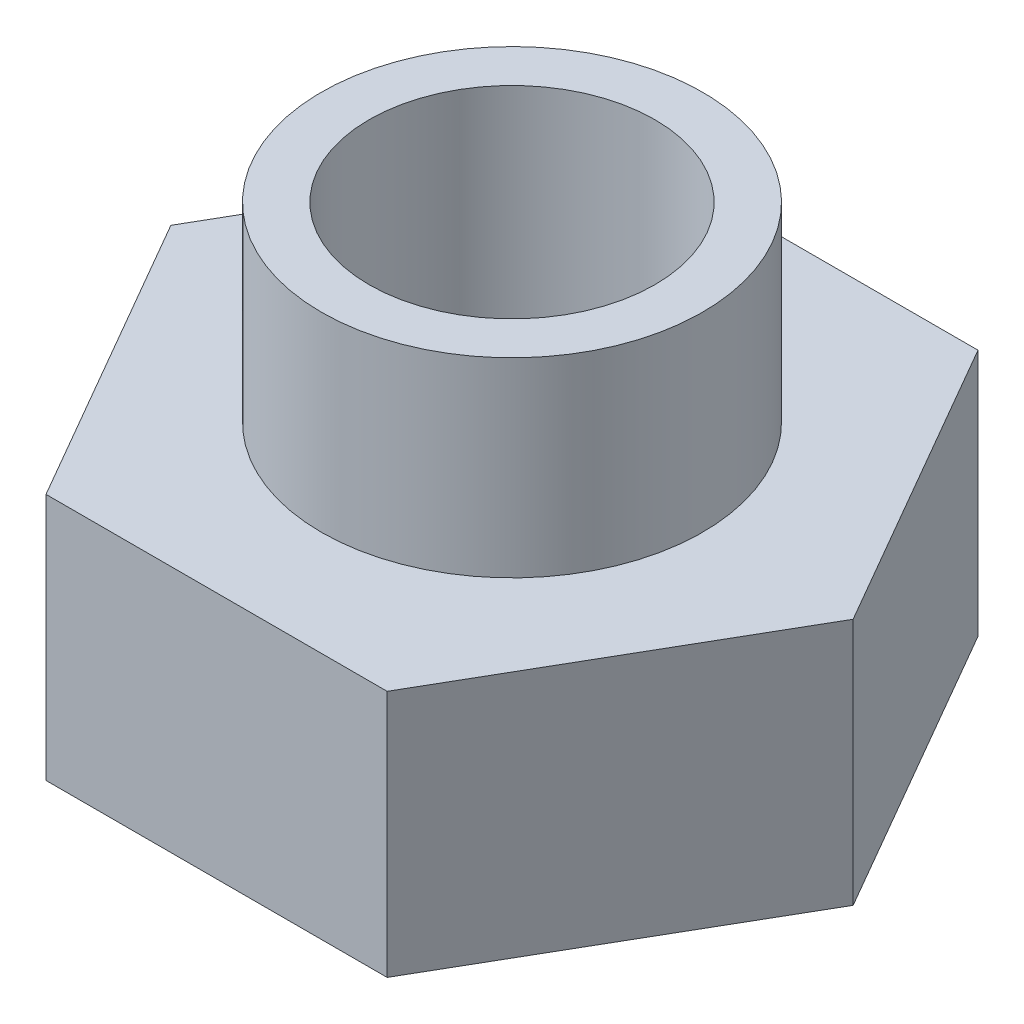
ISO-10303-21;
HEADER;
FILE_DESCRIPTION(('STEP AP214'),'2;1');
FILE_NAME('part.step','',(''),(''),'','','');
FILE_SCHEMA(('AUTOMOTIVE_DESIGN { 1 0 10303 214 1 1 1 1 }'));
ENDSEC;
DATA;
#1=APPLICATION_CONTEXT('core data for automotive mechanical design processes');
#2=APPLICATION_PROTOCOL_DEFINITION('international standard','automotive_design',2000,#1);
#3=PRODUCT_CONTEXT('',#1,'mechanical');
#4=PRODUCT('Part','Part','',(#3));
#5=PRODUCT_RELATED_PRODUCT_CATEGORY('part','',(#4));
#6=PRODUCT_DEFINITION_FORMATION('','',#4);
#7=PRODUCT_DEFINITION_CONTEXT('part definition',#1,'design');
#8=PRODUCT_DEFINITION('design','',#6,#7);
#9=PRODUCT_DEFINITION_SHAPE('','',#8);
#10=(LENGTH_UNIT() NAMED_UNIT(*) SI_UNIT(.MILLI.,.METRE.));
#11=(NAMED_UNIT(*) PLANE_ANGLE_UNIT() SI_UNIT($,.RADIAN.));
#12=(NAMED_UNIT(*) SI_UNIT($,.STERADIAN.) SOLID_ANGLE_UNIT());
#13=UNCERTAINTY_MEASURE_WITH_UNIT(LENGTH_MEASURE(1.E-05),#10,'distance_accuracy_value','');
#14=(GEOMETRIC_REPRESENTATION_CONTEXT(3) GLOBAL_UNCERTAINTY_ASSIGNED_CONTEXT((#13)) GLOBAL_UNIT_ASSIGNED_CONTEXT((#10,
#11,#12)) REPRESENTATION_CONTEXT('',''));
#15=CARTESIAN_POINT('',(0.,0.,0.));
#16=DIRECTION('',(0.,0.,1.));
#17=DIRECTION('',(1.,0.,0.));
#18=AXIS2_PLACEMENT_3D('',#15,#16,#17);
#19=CARTESIAN_POINT('',(-67.116968793294,65.,38.75));
#20=DIRECTION('',(0.866025403784439,0.,-0.5));
#21=DIRECTION('',(-0.5,0.,-0.866025403784439));
#22=AXIS2_PLACEMENT_3D('',#19,#20,#21);
#23=PLANE('',#22);
#24=DIRECTION('',(0.5,0.,0.866025403784439));
#25=VECTOR('',#24,1.);
#26=CARTESIAN_POINT('',(-67.116968793294,0.,38.75));
#27=LINE('',#26,#25);
#28=CARTESIAN_POINT('',(-89.489291724392,0.,0.));
#29=VERTEX_POINT('',#28);
#30=CARTESIAN_POINT('',(-44.744645862196,0.,77.5));
#31=VERTEX_POINT('',#30);
#32=EDGE_CURVE('E121',#29,#31,#27,.T.);
#33=ORIENTED_EDGE('',*,*,#32,.T.);
#34=DIRECTION('',(0.,-1.,0.));
#35=VECTOR('',#34,1.);
#36=CARTESIAN_POINT('',(-44.744645862196,65.,77.5));
#37=LINE('',#36,#35);
#38=CARTESIAN_POINT('',(-44.744645862196,65.,77.5));
#39=VERTEX_POINT('',#38);
#40=EDGE_CURVE('E11',#39,#31,#37,.T.);
#41=ORIENTED_EDGE('',*,*,#40,.F.);
#42=DIRECTION('',(0.5,0.,0.866025403784439));
#43=VECTOR('',#42,1.);
#44=CARTESIAN_POINT('',(-67.116968793294,65.,38.75));
#45=LINE('',#44,#43);
#46=CARTESIAN_POINT('',(-89.489291724392,65.,0.));
#47=VERTEX_POINT('',#46);
#48=EDGE_CURVE('E146',#47,#39,#45,.T.);
#49=ORIENTED_EDGE('',*,*,#48,.F.);
#50=DIRECTION('',(0.,-1.,0.));
#51=VECTOR('',#50,1.);
#52=CARTESIAN_POINT('',(-89.489291724392,65.,0.));
#53=LINE('',#52,#51);
#54=EDGE_CURVE('E117',#47,#29,#53,.T.);
#55=ORIENTED_EDGE('',*,*,#54,.T.);
#56=EDGE_LOOP('',(#33,#41,#49,#55));
#57=FACE_BOUND('',#56,.T.);
#58=ADVANCED_FACE('F37',(#57),#23,.F.);
#59=CARTESIAN_POINT('',(0.,65.,77.5));
#60=DIRECTION('',(0.,0.,-1.));
#61=DIRECTION('',(-1.,0.,0.));
#62=AXIS2_PLACEMENT_3D('',#59,#60,#61);
#63=PLANE('',#62);
#64=DIRECTION('',(1.,0.,0.));
#65=VECTOR('',#64,1.);
#66=CARTESIAN_POINT('',(0.,0.,77.5));
#67=LINE('',#66,#65);
#68=CARTESIAN_POINT('',(44.744645862196,0.,77.5));
#69=VERTEX_POINT('',#68);
#70=EDGE_CURVE('E124',#31,#69,#67,.T.);
#71=ORIENTED_EDGE('',*,*,#70,.T.);
#72=DIRECTION('',(0.,-1.,0.));
#73=VECTOR('',#72,1.);
#74=CARTESIAN_POINT('',(44.744645862196,65.,77.5));
#75=LINE('',#74,#73);
#76=CARTESIAN_POINT('',(44.744645862196,65.,77.5));
#77=VERTEX_POINT('',#76);
#78=EDGE_CURVE('E45',#77,#69,#75,.T.);
#79=ORIENTED_EDGE('',*,*,#78,.F.);
#80=DIRECTION('',(1.,0.,0.));
#81=VECTOR('',#80,1.);
#82=CARTESIAN_POINT('',(0.,65.,77.5));
#83=LINE('',#82,#81);
#84=EDGE_CURVE('E90',#39,#77,#83,.T.);
#85=ORIENTED_EDGE('',*,*,#84,.F.);
#86=ORIENTED_EDGE('',*,*,#40,.T.);
#87=EDGE_LOOP('',(#71,#79,#85,#86));
#88=FACE_BOUND('',#87,.T.);
#89=ADVANCED_FACE('F159',(#88),#63,.F.);
#90=CARTESIAN_POINT('',(67.116968793294,65.,38.75));
#91=DIRECTION('',(-0.866025403784439,0.,-0.5));
#92=DIRECTION('',(-0.5,0.,0.866025403784439));
#93=AXIS2_PLACEMENT_3D('',#90,#91,#92);
#94=PLANE('',#93);
#95=DIRECTION('',(0.5,0.,-0.866025403784439));
#96=VECTOR('',#95,1.);
#97=CARTESIAN_POINT('',(67.116968793294,0.,38.75));
#98=LINE('',#97,#96);
#99=CARTESIAN_POINT('',(89.489291724392,0.,0.));
#100=VERTEX_POINT('',#99);
#101=EDGE_CURVE('E127',#69,#100,#98,.T.);
#102=ORIENTED_EDGE('',*,*,#101,.T.);
#103=DIRECTION('',(0.,-1.,0.));
#104=VECTOR('',#103,1.);
#105=CARTESIAN_POINT('',(89.489291724392,65.,0.));
#106=LINE('',#105,#104);
#107=CARTESIAN_POINT('',(89.489291724392,65.,0.));
#108=VERTEX_POINT('',#107);
#109=EDGE_CURVE('E112',#108,#100,#106,.T.);
#110=ORIENTED_EDGE('',*,*,#109,.F.);
#111=DIRECTION('',(0.5,0.,-0.866025403784439));
#112=VECTOR('',#111,1.);
#113=CARTESIAN_POINT('',(67.116968793294,65.,38.75));
#114=LINE('',#113,#112);
#115=EDGE_CURVE('E103',#77,#108,#114,.T.);
#116=ORIENTED_EDGE('',*,*,#115,.F.);
#117=ORIENTED_EDGE('',*,*,#78,.T.);
#118=EDGE_LOOP('',(#102,#110,#116,#117));
#119=FACE_BOUND('',#118,.T.);
#120=ADVANCED_FACE('F138',(#119),#94,.F.);
#121=CARTESIAN_POINT('',(67.116968793294,65.,-38.75));
#122=DIRECTION('',(-0.866025403784439,0.,0.5));
#123=DIRECTION('',(0.5,0.,0.866025403784439));
#124=AXIS2_PLACEMENT_3D('',#121,#122,#123);
#125=PLANE('',#124);
#126=DIRECTION('',(-0.5,0.,-0.866025403784439));
#127=VECTOR('',#126,1.);
#128=CARTESIAN_POINT('',(67.116968793294,0.,-38.75));
#129=LINE('',#128,#127);
#130=CARTESIAN_POINT('',(44.744645862196,0.,-77.5));
#131=VERTEX_POINT('',#130);
#132=EDGE_CURVE('E111',#100,#131,#129,.T.);
#133=ORIENTED_EDGE('',*,*,#132,.T.);
#134=DIRECTION('',(0.,-1.,0.));
#135=VECTOR('',#134,1.);
#136=CARTESIAN_POINT('',(44.744645862196,65.,-77.5));
#137=LINE('',#136,#135);
#138=CARTESIAN_POINT('',(44.744645862196,65.,-77.5));
#139=VERTEX_POINT('',#138);
#140=EDGE_CURVE('E108',#139,#131,#137,.T.);
#141=ORIENTED_EDGE('',*,*,#140,.F.);
#142=DIRECTION('',(-0.5,0.,-0.866025403784439));
#143=VECTOR('',#142,1.);
#144=CARTESIAN_POINT('',(67.116968793294,65.,-38.75));
#145=LINE('',#144,#143);
#146=EDGE_CURVE('E97',#108,#139,#145,.T.);
#147=ORIENTED_EDGE('',*,*,#146,.F.);
#148=ORIENTED_EDGE('',*,*,#109,.T.);
#149=EDGE_LOOP('',(#133,#141,#147,#148));
#150=FACE_BOUND('',#149,.T.);
#151=ADVANCED_FACE('F109',(#150),#125,.F.);
#152=CARTESIAN_POINT('',(0.,65.,-77.5));
#153=DIRECTION('',(0.,0.,1.));
#154=DIRECTION('',(1.,0.,0.));
#155=AXIS2_PLACEMENT_3D('',#152,#153,#154);
#156=PLANE('',#155);
#157=DIRECTION('',(-1.,0.,0.));
#158=VECTOR('',#157,1.);
#159=CARTESIAN_POINT('',(0.,0.,-77.5));
#160=LINE('',#159,#158);
#161=CARTESIAN_POINT('',(-44.744645862196,0.,-77.5));
#162=VERTEX_POINT('',#161);
#163=EDGE_CURVE('E76',#131,#162,#160,.T.);
#164=ORIENTED_EDGE('',*,*,#163,.T.);
#165=DIRECTION('',(0.,-1.,0.));
#166=VECTOR('',#165,1.);
#167=CARTESIAN_POINT('',(-44.744645862196,65.,-77.5));
#168=LINE('',#167,#166);
#169=CARTESIAN_POINT('',(-44.744645862196,65.,-77.5));
#170=VERTEX_POINT('',#169);
#171=EDGE_CURVE('E113',#170,#162,#168,.T.);
#172=ORIENTED_EDGE('',*,*,#171,.F.);
#173=DIRECTION('',(-1.,0.,0.));
#174=VECTOR('',#173,1.);
#175=CARTESIAN_POINT('',(0.,65.,-77.5));
#176=LINE('',#175,#174);
#177=EDGE_CURVE('E101',#139,#170,#176,.T.);
#178=ORIENTED_EDGE('',*,*,#177,.F.);
#179=ORIENTED_EDGE('',*,*,#140,.T.);
#180=EDGE_LOOP('',(#164,#172,#178,#179));
#181=FACE_BOUND('',#180,.T.);
#182=ADVANCED_FACE('F115',(#181),#156,.F.);
#183=CARTESIAN_POINT('',(-67.116968793294,65.,-38.75));
#184=DIRECTION('',(0.866025403784439,0.,0.5));
#185=DIRECTION('',(0.5,0.,-0.866025403784439));
#186=AXIS2_PLACEMENT_3D('',#183,#184,#185);
#187=PLANE('',#186);
#188=DIRECTION('',(-0.5,0.,0.866025403784439));
#189=VECTOR('',#188,1.);
#190=CARTESIAN_POINT('',(-67.116968793294,0.,-38.75));
#191=LINE('',#190,#189);
#192=EDGE_CURVE('E82',#162,#29,#191,.T.);
#193=ORIENTED_EDGE('',*,*,#192,.T.);
#194=ORIENTED_EDGE('',*,*,#54,.F.);
#195=DIRECTION('',(-0.5,0.,0.866025403784439));
#196=VECTOR('',#195,1.);
#197=CARTESIAN_POINT('',(-67.116968793294,65.,-38.75));
#198=LINE('',#197,#196);
#199=EDGE_CURVE('E53',#170,#47,#198,.T.);
#200=ORIENTED_EDGE('',*,*,#199,.F.);
#201=ORIENTED_EDGE('',*,*,#171,.T.);
#202=EDGE_LOOP('',(#193,#194,#200,#201));
#203=FACE_BOUND('',#202,.T.);
#204=ADVANCED_FACE('F147',(#203),#187,.F.);
#205=CARTESIAN_POINT('',(0.,65.,0.));
#206=DIRECTION('',(0.,1.,0.));
#207=DIRECTION('',(0.,0.,1.));
#208=AXIS2_PLACEMENT_3D('',#205,#206,#207);
#209=PLANE('',#208);
#210=CARTESIAN_POINT('',(0.,65.,0.));
#211=DIRECTION('',(0.,1.,0.));
#212=DIRECTION('',(0.,0.,1.));
#213=AXIS2_PLACEMENT_3D('',#210,#211,#212);
#214=CIRCLE('',#213,50.);
#215=CARTESIAN_POINT('',(0.,65.,50.));
#216=VERTEX_POINT('',#215);
#217=EDGE_CURVE('E132',#216,#216,#214,.T.);
#218=ORIENTED_EDGE('',*,*,#217,.F.);
#219=EDGE_LOOP('',(#218));
#220=FACE_BOUND('',#219,.T.);
#221=ORIENTED_EDGE('',*,*,#48,.T.);
#222=ORIENTED_EDGE('',*,*,#84,.T.);
#223=ORIENTED_EDGE('',*,*,#115,.T.);
#224=ORIENTED_EDGE('',*,*,#146,.T.);
#225=ORIENTED_EDGE('',*,*,#177,.T.);
#226=ORIENTED_EDGE('',*,*,#199,.T.);
#227=EDGE_LOOP('',(#221,#222,#223,#224,#225,#226));
#228=FACE_BOUND('',#227,.T.);
#229=ADVANCED_FACE('F99',(#220,#228),#209,.T.);
#230=CARTESIAN_POINT('',(0.,0.,0.));
#231=DIRECTION('',(0.,1.,0.));
#232=DIRECTION('',(0.,0.,1.));
#233=AXIS2_PLACEMENT_3D('',#230,#231,#232);
#234=PLANE('',#233);
#235=ORIENTED_EDGE('',*,*,#32,.F.);
#236=ORIENTED_EDGE('',*,*,#192,.F.);
#237=ORIENTED_EDGE('',*,*,#163,.F.);
#238=ORIENTED_EDGE('',*,*,#132,.F.);
#239=ORIENTED_EDGE('',*,*,#101,.F.);
#240=ORIENTED_EDGE('',*,*,#70,.F.);
#241=EDGE_LOOP('',(#235,#236,#237,#238,#239,#240));
#242=FACE_BOUND('',#241,.T.);
#243=CARTESIAN_POINT('',(0.,0.,0.));
#244=DIRECTION('',(0.,1.,0.));
#245=DIRECTION('',(0.,0.,1.));
#246=AXIS2_PLACEMENT_3D('',#243,#244,#245);
#247=CIRCLE('',#246,37.5);
#248=CARTESIAN_POINT('',(0.,0.,37.5));
#249=VERTEX_POINT('',#248);
#250=EDGE_CURVE('E275',#249,#249,#247,.T.);
#251=ORIENTED_EDGE('',*,*,#250,.T.);
#252=EDGE_LOOP('',(#251));
#253=FACE_BOUND('',#252,.T.);
#254=ADVANCED_FACE('F141',(#242,#253),#234,.F.);
#255=CARTESIAN_POINT('',(0.,115.,0.));
#256=DIRECTION('',(0.,-1.,0.));
#257=DIRECTION('',(0.,0.,-1.));
#258=AXIS2_PLACEMENT_3D('',#255,#256,#257);
#259=CYLINDRICAL_SURFACE('',#258,37.5);
#260=CARTESIAN_POINT('',(0.,115.,0.));
#261=DIRECTION('',(0.,1.,0.));
#262=DIRECTION('',(0.,0.,1.));
#263=AXIS2_PLACEMENT_3D('',#260,#261,#262);
#264=CIRCLE('',#263,37.5);
#265=CARTESIAN_POINT('',(0.,115.,37.5));
#266=VERTEX_POINT('',#265);
#267=EDGE_CURVE('E270',#266,#266,#264,.T.);
#268=ORIENTED_EDGE('',*,*,#267,.T.);
#269=EDGE_LOOP('',(#268));
#270=FACE_BOUND('',#269,.T.);
#271=ORIENTED_EDGE('',*,*,#250,.F.);
#272=EDGE_LOOP('',(#271));
#273=FACE_BOUND('',#272,.T.);
#274=ADVANCED_FACE('F200',(#270,#273),#259,.F.);
#275=CARTESIAN_POINT('',(0.,115.,0.));
#276=DIRECTION('',(0.,-1.,0.));
#277=DIRECTION('',(0.,0.,-1.));
#278=AXIS2_PLACEMENT_3D('',#275,#276,#277);
#279=CYLINDRICAL_SURFACE('',#278,50.);
#280=ORIENTED_EDGE('',*,*,#217,.T.);
#281=EDGE_LOOP('',(#280));
#282=FACE_BOUND('',#281,.T.);
#283=CARTESIAN_POINT('',(0.,115.,0.));
#284=DIRECTION('',(0.,1.,0.));
#285=DIRECTION('',(0.,0.,1.));
#286=AXIS2_PLACEMENT_3D('',#283,#284,#285);
#287=CIRCLE('',#286,50.);
#288=CARTESIAN_POINT('',(0.,115.,50.));
#289=VERTEX_POINT('',#288);
#290=EDGE_CURVE('E125',#289,#289,#287,.T.);
#291=ORIENTED_EDGE('',*,*,#290,.F.);
#292=EDGE_LOOP('',(#291));
#293=FACE_BOUND('',#292,.T.);
#294=ADVANCED_FACE('F208',(#282,#293),#279,.T.);
#295=CARTESIAN_POINT('',(0.,115.,0.));
#296=DIRECTION('',(0.,1.,0.));
#297=DIRECTION('',(0.,0.,1.));
#298=AXIS2_PLACEMENT_3D('',#295,#296,#297);
#299=PLANE('',#298);
#300=ORIENTED_EDGE('',*,*,#267,.F.);
#301=EDGE_LOOP('',(#300));
#302=FACE_BOUND('',#301,.T.);
#303=ORIENTED_EDGE('',*,*,#290,.T.);
#304=EDGE_LOOP('',(#303));
#305=FACE_BOUND('',#304,.T.);
#306=ADVANCED_FACE('F219',(#302,#305),#299,.T.);
#307=CLOSED_SHELL('',(#58,#89,#120,#151,#182,#204,#229,#254,#274,#294,#306));
#308=MANIFOLD_SOLID_BREP('B2',#307);
#309=ADVANCED_BREP_SHAPE_REPRESENTATION('',(#18,#308),#14);
#310=SHAPE_DEFINITION_REPRESENTATION(#9,#309);
ENDSEC;
END-ISO-10303-21;
